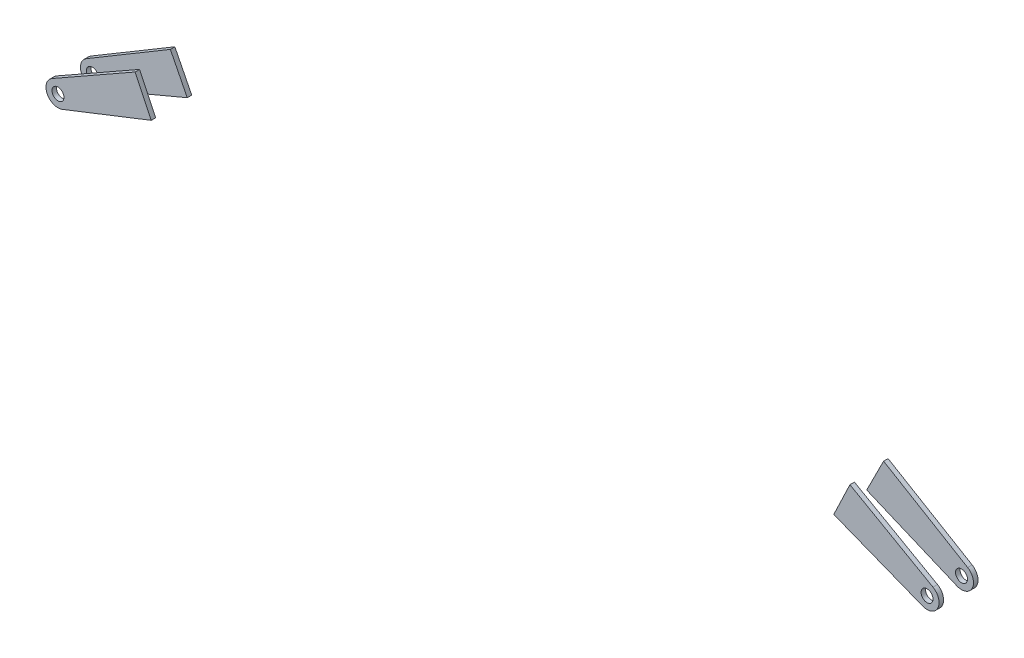
ISO-10303-21;
HEADER;
FILE_DESCRIPTION(('STEP AP214'),'2;1');
FILE_NAME('part.step','',(''),(''),'','','');
FILE_SCHEMA(('AUTOMOTIVE_DESIGN { 1 0 10303 214 1 1 1 1 }'));
ENDSEC;
DATA;
#1=APPLICATION_CONTEXT('core data for automotive mechanical design processes');
#2=APPLICATION_PROTOCOL_DEFINITION('international standard','automotive_design',2000,#1);
#3=PRODUCT_CONTEXT('',#1,'mechanical');
#4=PRODUCT('Part','Part','',(#3));
#5=PRODUCT_RELATED_PRODUCT_CATEGORY('part','',(#4));
#6=PRODUCT_DEFINITION_FORMATION('','',#4);
#7=PRODUCT_DEFINITION_CONTEXT('part definition',#1,'design');
#8=PRODUCT_DEFINITION('design','',#6,#7);
#9=PRODUCT_DEFINITION_SHAPE('','',#8);
#10=(LENGTH_UNIT() NAMED_UNIT(*) SI_UNIT(.MILLI.,.METRE.));
#11=(NAMED_UNIT(*) PLANE_ANGLE_UNIT() SI_UNIT($,.RADIAN.));
#12=(NAMED_UNIT(*) SI_UNIT($,.STERADIAN.) SOLID_ANGLE_UNIT());
#13=UNCERTAINTY_MEASURE_WITH_UNIT(LENGTH_MEASURE(1.E-05),#10,'distance_accuracy_value','');
#14=(GEOMETRIC_REPRESENTATION_CONTEXT(3) GLOBAL_UNCERTAINTY_ASSIGNED_CONTEXT((#13)) GLOBAL_UNIT_ASSIGNED_CONTEXT((#10,
#11,#12)) REPRESENTATION_CONTEXT('',''));
#15=CARTESIAN_POINT('',(0.,0.,0.));
#16=DIRECTION('',(0.,0.,1.));
#17=DIRECTION('',(1.,0.,0.));
#18=AXIS2_PLACEMENT_3D('',#15,#16,#17);
#19=CARTESIAN_POINT('',(0.,0.,151.999999999998));
#20=DIRECTION('',(0.,0.,-1.));
#21=DIRECTION('',(1.,0.,0.));
#22=AXIS2_PLACEMENT_3D('',#19,#20,#21);
#23=PLANE('',#22);
#24=DIRECTION('',(0.921662565807095,0.387992415892221,0.));
#25=VECTOR('',#24,1.);
#26=CARTESIAN_POINT('',(-286.896060672862,-1977.37330052646,151.999999999998));
#27=LINE('',#26,#25);
#28=CARTESIAN_POINT('',(-286.896060672862,-1977.37330052646,151.999999999998));
#29=VERTEX_POINT('',#28);
#30=CARTESIAN_POINT('',(-226.717276886473,-1952.03982971733,151.999999999998));
#31=VERTEX_POINT('',#30);
#32=EDGE_CURVE('E210',#29,#31,#27,.T.);
#33=ORIENTED_EDGE('',*,*,#32,.F.);
#34=CARTESIAN_POINT('',(-290.,-1970.,151.999999999998));
#35=DIRECTION('',(0.,0.,-1.));
#36=DIRECTION('',(-1.,0.,0.));
#37=AXIS2_PLACEMENT_3D('',#34,#35,#36);
#38=CIRCLE('',#37,8.00000000000014);
#39=CARTESIAN_POINT('',(-294.092411866866,-1963.12597897065,151.999999999998));
#40=VERTEX_POINT('',#39);
#41=EDGE_CURVE('E198',#29,#40,#38,.T.);
#42=ORIENTED_EDGE('',*,*,#41,.T.);
#43=DIRECTION('',(-0.859252628668639,-0.511551483358258,0.));
#44=VECTOR('',#43,1.);
#45=CARTESIAN_POINT('',(-237.988605466467,-1929.72487616502,151.999999999998));
#46=LINE('',#45,#44);
#47=CARTESIAN_POINT('',(-237.988605466467,-1929.72487616502,151.999999999998));
#48=VERTEX_POINT('',#47);
#49=EDGE_CURVE('E190',#48,#40,#46,.T.);
#50=ORIENTED_EDGE('',*,*,#49,.F.);
#51=DIRECTION('',(-0.450853143199749,0.892598142092457,0.));
#52=VECTOR('',#51,1.);
#53=CARTESIAN_POINT('',(-226.717276886473,-1952.03982971733,151.999999999998));
#54=LINE('',#53,#52);
#55=EDGE_CURVE('E147',#31,#48,#54,.T.);
#56=ORIENTED_EDGE('',*,*,#55,.F.);
#57=EDGE_LOOP('',(#33,#42,#50,#56));
#58=FACE_BOUND('',#57,.T.);
#59=CARTESIAN_POINT('',(-290.,-1970.,151.999999999998));
#60=DIRECTION('',(0.,0.,-1.));
#61=DIRECTION('',(-1.,0.,0.));
#62=AXIS2_PLACEMENT_3D('',#59,#60,#61);
#63=CIRCLE('',#62,3.99999999999999);
#64=CARTESIAN_POINT('',(-294.,-1970.,151.999999999998));
#65=VERTEX_POINT('',#64);
#66=EDGE_CURVE('E212',#65,#65,#63,.T.);
#67=ORIENTED_EDGE('',*,*,#66,.F.);
#68=EDGE_LOOP('',(#67));
#69=FACE_BOUND('',#68,.T.);
#70=ADVANCED_FACE('F138',(#58,#69),#23,.T.);
#71=CARTESIAN_POINT('',(0.,0.,154.999999999998));
#72=DIRECTION('',(0.,0.,-1.));
#73=DIRECTION('',(1.,0.,0.));
#74=AXIS2_PLACEMENT_3D('',#71,#72,#73);
#75=PLANE('',#74);
#76=DIRECTION('',(0.921662565807095,0.387992415892221,0.));
#77=VECTOR('',#76,1.);
#78=CARTESIAN_POINT('',(-286.896060672862,-1977.37330052646,154.999999999998));
#79=LINE('',#78,#77);
#80=CARTESIAN_POINT('',(-286.896060672862,-1977.37330052646,154.999999999998));
#81=VERTEX_POINT('',#80);
#82=CARTESIAN_POINT('',(-226.717276886473,-1952.03982971733,154.999999999998));
#83=VERTEX_POINT('',#82);
#84=EDGE_CURVE('E226',#81,#83,#79,.T.);
#85=ORIENTED_EDGE('',*,*,#84,.T.);
#86=DIRECTION('',(-0.450853143199749,0.892598142092457,0.));
#87=VECTOR('',#86,1.);
#88=CARTESIAN_POINT('',(-226.717276886473,-1952.03982971733,154.999999999998));
#89=LINE('',#88,#87);
#90=CARTESIAN_POINT('',(-237.988605466467,-1929.72487616502,154.999999999998));
#91=VERTEX_POINT('',#90);
#92=EDGE_CURVE('E13',#83,#91,#89,.T.);
#93=ORIENTED_EDGE('',*,*,#92,.T.);
#94=DIRECTION('',(-0.859252628668639,-0.511551483358258,0.));
#95=VECTOR('',#94,1.);
#96=CARTESIAN_POINT('',(-237.988605466467,-1929.72487616502,154.999999999998));
#97=LINE('',#96,#95);
#98=CARTESIAN_POINT('',(-294.092411866866,-1963.12597897065,154.999999999998));
#99=VERTEX_POINT('',#98);
#100=EDGE_CURVE('E188',#91,#99,#97,.T.);
#101=ORIENTED_EDGE('',*,*,#100,.T.);
#102=CARTESIAN_POINT('',(-290.,-1970.,154.999999999998));
#103=DIRECTION('',(0.,0.,-1.));
#104=DIRECTION('',(-1.,0.,0.));
#105=AXIS2_PLACEMENT_3D('',#102,#103,#104);
#106=CIRCLE('',#105,8.00000000000014);
#107=EDGE_CURVE('E192',#81,#99,#106,.T.);
#108=ORIENTED_EDGE('',*,*,#107,.F.);
#109=EDGE_LOOP('',(#85,#93,#101,#108));
#110=FACE_BOUND('',#109,.T.);
#111=CARTESIAN_POINT('',(-290.,-1970.,154.999999999998));
#112=DIRECTION('',(0.,0.,-1.));
#113=DIRECTION('',(-1.,0.,0.));
#114=AXIS2_PLACEMENT_3D('',#111,#112,#113);
#115=CIRCLE('',#114,3.99999999999999);
#116=CARTESIAN_POINT('',(-294.,-1970.,154.999999999998));
#117=VERTEX_POINT('',#116);
#118=EDGE_CURVE('E238',#117,#117,#115,.T.);
#119=ORIENTED_EDGE('',*,*,#118,.T.);
#120=EDGE_LOOP('',(#119));
#121=FACE_BOUND('',#120,.T.);
#122=ADVANCED_FACE('F200',(#110,#121),#75,.F.);
#123=CARTESIAN_POINT('',(-286.896060672862,-1977.37330052646,154.999999999998));
#124=DIRECTION('',(0.387992415892221,-0.921662565807095,0.));
#125=DIRECTION('',(-0.921662565807095,-0.387992415892221,0.));
#126=AXIS2_PLACEMENT_3D('',#123,#124,#125);
#127=PLANE('',#126);
#128=ORIENTED_EDGE('',*,*,#32,.T.);
#129=DIRECTION('',(0.,0.,-1.));
#130=VECTOR('',#129,1.);
#131=CARTESIAN_POINT('',(-226.717276886473,-1952.03982971733,154.999999999998));
#132=LINE('',#131,#130);
#133=EDGE_CURVE('E156',#83,#31,#132,.T.);
#134=ORIENTED_EDGE('',*,*,#133,.F.);
#135=ORIENTED_EDGE('',*,*,#84,.F.);
#136=DIRECTION('',(0.,0.,-1.));
#137=VECTOR('',#136,1.);
#138=CARTESIAN_POINT('',(-286.896060672862,-1977.37330052646,154.999999999998));
#139=LINE('',#138,#137);
#140=EDGE_CURVE('E172',#81,#29,#139,.T.);
#141=ORIENTED_EDGE('',*,*,#140,.T.);
#142=EDGE_LOOP('',(#128,#134,#135,#141));
#143=FACE_BOUND('',#142,.T.);
#144=ADVANCED_FACE('F253',(#143),#127,.T.);
#145=CARTESIAN_POINT('',(-237.988605466467,-1929.72487616502,154.999999999998));
#146=DIRECTION('',(-0.511551483358258,0.859252628668639,0.));
#147=DIRECTION('',(0.859252628668639,0.511551483358258,0.));
#148=AXIS2_PLACEMENT_3D('',#145,#146,#147);
#149=PLANE('',#148);
#150=ORIENTED_EDGE('',*,*,#49,.T.);
#151=DIRECTION('',(0.,0.,-1.));
#152=VECTOR('',#151,1.);
#153=CARTESIAN_POINT('',(-294.092411866866,-1963.12597897065,154.999999999998));
#154=LINE('',#153,#152);
#155=EDGE_CURVE('E179',#99,#40,#154,.T.);
#156=ORIENTED_EDGE('',*,*,#155,.F.);
#157=ORIENTED_EDGE('',*,*,#100,.F.);
#158=DIRECTION('',(0.,0.,-1.));
#159=VECTOR('',#158,1.);
#160=CARTESIAN_POINT('',(-237.988605466467,-1929.72487616502,154.999999999998));
#161=LINE('',#160,#159);
#162=EDGE_CURVE('E185',#91,#48,#161,.T.);
#163=ORIENTED_EDGE('',*,*,#162,.T.);
#164=EDGE_LOOP('',(#150,#156,#157,#163));
#165=FACE_BOUND('',#164,.T.);
#166=ADVANCED_FACE('F186',(#165),#149,.T.);
#167=CARTESIAN_POINT('',(-226.717276886473,-1952.03982971733,154.999999999998));
#168=DIRECTION('',(0.892598142092457,0.450853143199749,0.));
#169=DIRECTION('',(0.450853143199749,-0.892598142092457,0.));
#170=AXIS2_PLACEMENT_3D('',#167,#168,#169);
#171=PLANE('',#170);
#172=ORIENTED_EDGE('',*,*,#55,.T.);
#173=ORIENTED_EDGE('',*,*,#162,.F.);
#174=ORIENTED_EDGE('',*,*,#92,.F.);
#175=ORIENTED_EDGE('',*,*,#133,.T.);
#176=EDGE_LOOP('',(#172,#173,#174,#175));
#177=FACE_BOUND('',#176,.T.);
#178=ADVANCED_FACE('F260',(#177),#171,.T.);
#179=CARTESIAN_POINT('',(-290.,-1970.,154.999999999998));
#180=DIRECTION('',(0.,0.,-1.));
#181=DIRECTION('',(1.,0.,0.));
#182=AXIS2_PLACEMENT_3D('',#179,#180,#181);
#183=CYLINDRICAL_SURFACE('',#182,8.00000000000014);
#184=ORIENTED_EDGE('',*,*,#41,.F.);
#185=ORIENTED_EDGE('',*,*,#140,.F.);
#186=ORIENTED_EDGE('',*,*,#107,.T.);
#187=ORIENTED_EDGE('',*,*,#155,.T.);
#188=EDGE_LOOP('',(#184,#185,#186,#187));
#189=FACE_BOUND('',#188,.T.);
#190=ADVANCED_FACE('F195',(#189),#183,.T.);
#191=CARTESIAN_POINT('',(-290.,-1970.,154.999999999998));
#192=DIRECTION('',(0.,0.,-1.));
#193=DIRECTION('',(1.,0.,0.));
#194=AXIS2_PLACEMENT_3D('',#191,#192,#193);
#195=CYLINDRICAL_SURFACE('',#194,3.99999999999999);
#196=ORIENTED_EDGE('',*,*,#118,.F.);
#197=EDGE_LOOP('',(#196));
#198=FACE_BOUND('',#197,.T.);
#199=ORIENTED_EDGE('',*,*,#66,.T.);
#200=EDGE_LOOP('',(#199));
#201=FACE_BOUND('',#200,.T.);
#202=ADVANCED_FACE('F242',(#198,#201),#195,.F.);
#203=CLOSED_SHELL('',(#70,#122,#144,#166,#178,#190,#202));
#204=MANIFOLD_SOLID_BREP('B2',#203);
#205=CARTESIAN_POINT('',(2.63160024179318E-11,8.0263807374692E-12,177.999999999859));
#206=DIRECTION('',(1.50377156674017E-13,0.,1.));
#207=DIRECTION('',(-1.,0.,1.50377156674017E-13));
#208=AXIS2_PLACEMENT_3D('',#205,#206,#207);
#209=PLANE('',#208);
#210=CARTESIAN_POINT('',(-290.,-1970.,177.999999999998));
#211=DIRECTION('',(0.,0.,-1.));
#212=DIRECTION('',(-1.,0.,0.));
#213=AXIS2_PLACEMENT_3D('',#210,#211,#212);
#214=CIRCLE('',#213,3.99999999999999);
#215=CARTESIAN_POINT('',(-294.,-1970.,177.999999999998));
#216=VERTEX_POINT('',#215);
#217=EDGE_CURVE('E397',#216,#216,#214,.T.);
#218=ORIENTED_EDGE('',*,*,#217,.T.);
#219=EDGE_LOOP('',(#218));
#220=FACE_BOUND('',#219,.T.);
#221=DIRECTION('',(0.930659776692997,0.365885747256901,-2.04653150000507E-13));
#222=VECTOR('',#221,1.);
#223=CARTESIAN_POINT('',(-287.072914021945,-1977.44527821354,177.999999999998));
#224=LINE('',#223,#222);
#225=CARTESIAN_POINT('',(-287.072914021945,-1977.44527821354,177.999999999998));
#226=VERTEX_POINT('',#225);
#227=CARTESIAN_POINT('',(-227.750255328197,-1954.12277535159,177.999999999985));
#228=VERTEX_POINT('',#227);
#229=EDGE_CURVE('E381',#226,#228,#224,.T.);
#230=ORIENTED_EDGE('',*,*,#229,.T.);
#231=DIRECTION('',(-0.430959965901078,0.9023710477351,0.));
#232=VECTOR('',#231,1.);
#233=CARTESIAN_POINT('',(-227.750255328197,-1954.12277535159,177.999999999985));
#234=LINE('',#233,#232);
#235=CARTESIAN_POINT('',(-238.524254475723,-1931.56349915821,177.999999999986));
#236=VERTEX_POINT('',#235);
#237=EDGE_CURVE('E380',#228,#236,#234,.T.);
#238=ORIENTED_EDGE('',*,*,#237,.T.);
#239=DIRECTION('',(0.869538965268074,0.493864341576234,-1.99427963191984E-13));
#240=VECTOR('',#239,1.);
#241=CARTESIAN_POINT('',(-293.95091473261,-1963.04368827786,177.999999999999));
#242=LINE('',#241,#240);
#243=CARTESIAN_POINT('',(-293.95091473261,-1963.04368827786,177.999999999999));
#244=VERTEX_POINT('',#243);
#245=EDGE_CURVE('E369',#244,#236,#242,.T.);
#246=ORIENTED_EDGE('',*,*,#245,.F.);
#247=CARTESIAN_POINT('',(-290.,-1970.,177.999999999998));
#248=DIRECTION('',(-1.38777878078146E-13,0.,-1.));
#249=DIRECTION('',(-1.,0.,1.38777878078146E-13));
#250=AXIS2_PLACEMENT_3D('',#247,#248,#249);
#251=CIRCLE('',#250,7.9999999999999);
#252=EDGE_CURVE('E326',#226,#244,#251,.T.);
#253=ORIENTED_EDGE('',*,*,#252,.F.);
#254=EDGE_LOOP('',(#230,#238,#246,#253));
#255=FACE_BOUND('',#254,.T.);
#256=ADVANCED_FACE('F317',(#220,#255),#209,.T.);
#257=CARTESIAN_POINT('',(2.63160024179318E-11,8.0263807374692E-12,174.999999999859));
#258=DIRECTION('',(1.50377156674017E-13,0.,1.));
#259=DIRECTION('',(-1.,0.,1.50377156674017E-13));
#260=AXIS2_PLACEMENT_3D('',#257,#258,#259);
#261=PLANE('',#260);
#262=CARTESIAN_POINT('',(-290.,-1970.,174.999999999998));
#263=DIRECTION('',(0.,0.,-1.));
#264=DIRECTION('',(-1.,0.,0.));
#265=AXIS2_PLACEMENT_3D('',#262,#263,#264);
#266=CIRCLE('',#265,3.99999999999999);
#267=CARTESIAN_POINT('',(-294.,-1970.,174.999999999998));
#268=VERTEX_POINT('',#267);
#269=EDGE_CURVE('E433',#268,#268,#266,.T.);
#270=ORIENTED_EDGE('',*,*,#269,.F.);
#271=EDGE_LOOP('',(#270));
#272=FACE_BOUND('',#271,.T.);
#273=DIRECTION('',(0.930659776692997,0.365885747256901,-2.04653150000507E-13));
#274=VECTOR('',#273,1.);
#275=CARTESIAN_POINT('',(-287.072914021945,-1977.44527821354,174.999999999998));
#276=LINE('',#275,#274);
#277=CARTESIAN_POINT('',(-287.072914021945,-1977.44527821354,174.999999999998));
#278=VERTEX_POINT('',#277);
#279=CARTESIAN_POINT('',(-227.750255328197,-1954.12277535159,174.999999999985));
#280=VERTEX_POINT('',#279);
#281=EDGE_CURVE('E377',#278,#280,#276,.T.);
#282=ORIENTED_EDGE('',*,*,#281,.F.);
#283=CARTESIAN_POINT('',(-290.,-1970.,174.999999999998));
#284=DIRECTION('',(-1.38777878078146E-13,0.,-1.));
#285=DIRECTION('',(-1.,0.,1.38777878078146E-13));
#286=AXIS2_PLACEMENT_3D('',#283,#284,#285);
#287=CIRCLE('',#286,7.9999999999999);
#288=CARTESIAN_POINT('',(-293.95091473261,-1963.04368827786,174.999999999999));
#289=VERTEX_POINT('',#288);
#290=EDGE_CURVE('E136',#278,#289,#287,.T.);
#291=ORIENTED_EDGE('',*,*,#290,.T.);
#292=DIRECTION('',(0.869538965268074,0.493864341576234,-1.99427963191984E-13));
#293=VECTOR('',#292,1.);
#294=CARTESIAN_POINT('',(-293.95091473261,-1963.04368827786,174.999999999999));
#295=LINE('',#294,#293);
#296=CARTESIAN_POINT('',(-238.524254475723,-1931.56349915821,174.999999999986));
#297=VERTEX_POINT('',#296);
#298=EDGE_CURVE('E368',#289,#297,#295,.T.);
#299=ORIENTED_EDGE('',*,*,#298,.T.);
#300=DIRECTION('',(-0.430959965901078,0.9023710477351,0.));
#301=VECTOR('',#300,1.);
#302=CARTESIAN_POINT('',(-227.750255328197,-1954.12277535159,174.999999999985));
#303=LINE('',#302,#301);
#304=EDGE_CURVE('E378',#280,#297,#303,.T.);
#305=ORIENTED_EDGE('',*,*,#304,.F.);
#306=EDGE_LOOP('',(#282,#291,#299,#305));
#307=FACE_BOUND('',#306,.T.);
#308=ADVANCED_FACE('F376',(#272,#307),#261,.F.);
#309=CARTESIAN_POINT('',(-287.072914021945,-1977.44527821354,174.999999999998));
#310=DIRECTION('',(-0.365885747256901,0.930659776692997,0.));
#311=DIRECTION('',(0.930659776692997,0.365885747256901,0.));
#312=AXIS2_PLACEMENT_3D('',#309,#310,#311);
#313=PLANE('',#312);
#314=ORIENTED_EDGE('',*,*,#229,.F.);
#315=DIRECTION('',(0.,0.,1.));
#316=VECTOR('',#315,1.);
#317=CARTESIAN_POINT('',(-287.072914021945,-1977.44527821354,174.999999999998));
#318=LINE('',#317,#316);
#319=EDGE_CURVE('E335',#278,#226,#318,.T.);
#320=ORIENTED_EDGE('',*,*,#319,.F.);
#321=ORIENTED_EDGE('',*,*,#281,.T.);
#322=DIRECTION('',(0.,0.,1.));
#323=VECTOR('',#322,1.);
#324=CARTESIAN_POINT('',(-227.750255328197,-1954.12277535159,174.999999999985));
#325=LINE('',#324,#323);
#326=EDGE_CURVE('E344',#280,#228,#325,.T.);
#327=ORIENTED_EDGE('',*,*,#326,.T.);
#328=EDGE_LOOP('',(#314,#320,#321,#327));
#329=FACE_BOUND('',#328,.T.);
#330=ADVANCED_FACE('F415',(#329),#313,.F.);
#331=CARTESIAN_POINT('',(-227.750255328197,-1954.12277535159,174.999999999985));
#332=DIRECTION('',(-0.9023710477351,-0.430959965901078,0.));
#333=DIRECTION('',(-0.430959965901078,0.9023710477351,0.));
#334=AXIS2_PLACEMENT_3D('',#331,#332,#333);
#335=PLANE('',#334);
#336=ORIENTED_EDGE('',*,*,#237,.F.);
#337=ORIENTED_EDGE('',*,*,#326,.F.);
#338=ORIENTED_EDGE('',*,*,#304,.T.);
#339=DIRECTION('',(0.,0.,1.));
#340=VECTOR('',#339,1.);
#341=CARTESIAN_POINT('',(-238.524254475723,-1931.56349915821,174.999999999986));
#342=LINE('',#341,#340);
#343=EDGE_CURVE('E352',#297,#236,#342,.T.);
#344=ORIENTED_EDGE('',*,*,#343,.T.);
#345=EDGE_LOOP('',(#336,#337,#338,#344));
#346=FACE_BOUND('',#345,.T.);
#347=ADVANCED_FACE('F413',(#346),#335,.F.);
#348=CARTESIAN_POINT('',(-290.,-1970.,174.999999999998));
#349=DIRECTION('',(0.,0.,1.));
#350=DIRECTION('',(-1.,0.,0.));
#351=AXIS2_PLACEMENT_3D('',#348,#349,#350);
#352=CYLINDRICAL_SURFACE('',#351,7.9999999999999);
#353=ORIENTED_EDGE('',*,*,#252,.T.);
#354=DIRECTION('',(0.,0.,1.));
#355=VECTOR('',#354,1.);
#356=CARTESIAN_POINT('',(-293.95091473261,-1963.04368827786,174.999999999999));
#357=LINE('',#356,#355);
#358=EDGE_CURVE('E361',#289,#244,#357,.T.);
#359=ORIENTED_EDGE('',*,*,#358,.F.);
#360=ORIENTED_EDGE('',*,*,#290,.F.);
#361=ORIENTED_EDGE('',*,*,#319,.T.);
#362=EDGE_LOOP('',(#353,#359,#360,#361));
#363=FACE_BOUND('',#362,.T.);
#364=ADVANCED_FACE('F363',(#363),#352,.T.);
#365=CARTESIAN_POINT('',(-293.95091473261,-1963.04368827786,174.999999999999));
#366=DIRECTION('',(-0.493864341576234,0.869538965268074,0.));
#367=DIRECTION('',(0.869538965268074,0.493864341576234,0.));
#368=AXIS2_PLACEMENT_3D('',#365,#366,#367);
#369=PLANE('',#368);
#370=ORIENTED_EDGE('',*,*,#245,.T.);
#371=ORIENTED_EDGE('',*,*,#343,.F.);
#372=ORIENTED_EDGE('',*,*,#298,.F.);
#373=ORIENTED_EDGE('',*,*,#358,.T.);
#374=EDGE_LOOP('',(#370,#371,#372,#373));
#375=FACE_BOUND('',#374,.T.);
#376=ADVANCED_FACE('F372',(#375),#369,.T.);
#377=CARTESIAN_POINT('',(-290.,-1970.,174.999999999998));
#378=DIRECTION('',(0.,0.,1.));
#379=DIRECTION('',(-1.,0.,0.));
#380=AXIS2_PLACEMENT_3D('',#377,#378,#379);
#381=CYLINDRICAL_SURFACE('',#380,3.99999999999999);
#382=ORIENTED_EDGE('',*,*,#269,.T.);
#383=EDGE_LOOP('',(#382));
#384=FACE_BOUND('',#383,.T.);
#385=ORIENTED_EDGE('',*,*,#217,.F.);
#386=EDGE_LOOP('',(#385));
#387=FACE_BOUND('',#386,.T.);
#388=ADVANCED_FACE('F441',(#384,#387),#381,.F.);
#389=CLOSED_SHELL('',(#256,#308,#330,#347,#364,#376,#388));
#390=MANIFOLD_SOLID_BREP('B7',#389);
#391=CARTESIAN_POINT('',(0.,0.,151.999999999998));
#392=DIRECTION('',(0.,0.,-1.));
#393=DIRECTION('',(-1.,0.,0.));
#394=AXIS2_PLACEMENT_3D('',#391,#392,#393);
#395=PLANE('',#394);
#396=DIRECTION('',(-0.921662565807095,0.387992415892221,0.));
#397=VECTOR('',#396,1.);
#398=CARTESIAN_POINT('',(286.896060672862,-1977.37330052646,151.999999999998));
#399=LINE('',#398,#397);
#400=CARTESIAN_POINT('',(286.896060672862,-1977.37330052646,151.999999999998));
#401=VERTEX_POINT('',#400);
#402=CARTESIAN_POINT('',(226.717276886473,-1952.03982971733,151.999999999998));
#403=VERTEX_POINT('',#402);
#404=EDGE_CURVE('E525',#401,#403,#399,.T.);
#405=ORIENTED_EDGE('',*,*,#404,.T.);
#406=DIRECTION('',(0.450853143199749,0.892598142092457,0.));
#407=VECTOR('',#406,1.);
#408=CARTESIAN_POINT('',(226.717276886473,-1952.03982971733,151.999999999998));
#409=LINE('',#408,#407);
#410=CARTESIAN_POINT('',(237.988605466467,-1929.72487616502,151.999999999998));
#411=VERTEX_POINT('',#410);
#412=EDGE_CURVE('E504',#403,#411,#409,.T.);
#413=ORIENTED_EDGE('',*,*,#412,.T.);
#414=DIRECTION('',(0.859252628668639,-0.511551483358258,0.));
#415=VECTOR('',#414,1.);
#416=CARTESIAN_POINT('',(237.988605466467,-1929.72487616502,151.999999999998));
#417=LINE('',#416,#415);
#418=CARTESIAN_POINT('',(294.092411866866,-1963.12597897065,151.999999999998));
#419=VERTEX_POINT('',#418);
#420=EDGE_CURVE('E534',#411,#419,#417,.T.);
#421=ORIENTED_EDGE('',*,*,#420,.T.);
#422=CARTESIAN_POINT('',(290.,-1970.,151.999999999998));
#423=DIRECTION('',(0.,0.,1.));
#424=DIRECTION('',(1.,0.,0.));
#425=AXIS2_PLACEMENT_3D('',#422,#423,#424);
#426=CIRCLE('',#425,8.00000000000014);
#427=EDGE_CURVE('E530',#401,#419,#426,.T.);
#428=ORIENTED_EDGE('',*,*,#427,.F.);
#429=EDGE_LOOP('',(#405,#413,#421,#428));
#430=FACE_BOUND('',#429,.T.);
#431=CARTESIAN_POINT('',(290.,-1970.,151.999999999998));
#432=DIRECTION('',(0.,0.,1.));
#433=DIRECTION('',(1.,0.,0.));
#434=AXIS2_PLACEMENT_3D('',#431,#432,#433);
#435=CIRCLE('',#434,3.99999999999999);
#436=CARTESIAN_POINT('',(294.,-1970.,151.999999999998));
#437=VERTEX_POINT('',#436);
#438=EDGE_CURVE('E569',#437,#437,#435,.T.);
#439=ORIENTED_EDGE('',*,*,#438,.T.);
#440=EDGE_LOOP('',(#439));
#441=FACE_BOUND('',#440,.T.);
#442=ADVANCED_FACE('F495',(#430,#441),#395,.T.);
#443=CARTESIAN_POINT('',(0.,0.,154.999999999998));
#444=DIRECTION('',(0.,0.,-1.));
#445=DIRECTION('',(-1.,0.,0.));
#446=AXIS2_PLACEMENT_3D('',#443,#444,#445);
#447=PLANE('',#446);
#448=DIRECTION('',(-0.921662565807095,0.387992415892221,0.));
#449=VECTOR('',#448,1.);
#450=CARTESIAN_POINT('',(286.896060672862,-1977.37330052646,154.999999999998));
#451=LINE('',#450,#449);
#452=CARTESIAN_POINT('',(286.896060672862,-1977.37330052646,154.999999999998));
#453=VERTEX_POINT('',#452);
#454=CARTESIAN_POINT('',(226.717276886473,-1952.03982971733,154.999999999998));
#455=VERTEX_POINT('',#454);
#456=EDGE_CURVE('E549',#453,#455,#451,.T.);
#457=ORIENTED_EDGE('',*,*,#456,.F.);
#458=CARTESIAN_POINT('',(290.,-1970.,154.999999999998));
#459=DIRECTION('',(0.,0.,1.));
#460=DIRECTION('',(1.,0.,0.));
#461=AXIS2_PLACEMENT_3D('',#458,#459,#460);
#462=CIRCLE('',#461,8.00000000000014);
#463=CARTESIAN_POINT('',(294.092411866866,-1963.12597897065,154.999999999998));
#464=VERTEX_POINT('',#463);
#465=EDGE_CURVE('E541',#453,#464,#462,.T.);
#466=ORIENTED_EDGE('',*,*,#465,.T.);
#467=DIRECTION('',(0.859252628668639,-0.511551483358258,0.));
#468=VECTOR('',#467,1.);
#469=CARTESIAN_POINT('',(237.988605466467,-1929.72487616502,154.999999999998));
#470=LINE('',#469,#468);
#471=CARTESIAN_POINT('',(237.988605466467,-1929.72487616502,154.999999999998));
#472=VERTEX_POINT('',#471);
#473=EDGE_CURVE('E546',#472,#464,#470,.T.);
#474=ORIENTED_EDGE('',*,*,#473,.F.);
#475=DIRECTION('',(0.450853143199749,0.892598142092457,0.));
#476=VECTOR('',#475,1.);
#477=CARTESIAN_POINT('',(226.717276886473,-1952.03982971733,154.999999999998));
#478=LINE('',#477,#476);
#479=EDGE_CURVE('E315',#455,#472,#478,.T.);
#480=ORIENTED_EDGE('',*,*,#479,.F.);
#481=EDGE_LOOP('',(#457,#466,#474,#480));
#482=FACE_BOUND('',#481,.T.);
#483=CARTESIAN_POINT('',(290.,-1970.,154.999999999998));
#484=DIRECTION('',(0.,0.,1.));
#485=DIRECTION('',(1.,0.,0.));
#486=AXIS2_PLACEMENT_3D('',#483,#484,#485);
#487=CIRCLE('',#486,3.99999999999999);
#488=CARTESIAN_POINT('',(294.,-1970.,154.999999999998));
#489=VERTEX_POINT('',#488);
#490=EDGE_CURVE('E596',#489,#489,#487,.T.);
#491=ORIENTED_EDGE('',*,*,#490,.F.);
#492=EDGE_LOOP('',(#491));
#493=FACE_BOUND('',#492,.T.);
#494=ADVANCED_FACE('F543',(#482,#493),#447,.F.);
#495=CARTESIAN_POINT('',(286.896060672862,-1977.37330052646,154.999999999998));
#496=DIRECTION('',(-0.387992415892221,-0.921662565807095,0.));
#497=DIRECTION('',(0.921662565807095,-0.387992415892221,0.));
#498=AXIS2_PLACEMENT_3D('',#495,#496,#497);
#499=PLANE('',#498);
#500=ORIENTED_EDGE('',*,*,#404,.F.);
#501=DIRECTION('',(0.,0.,-1.));
#502=VECTOR('',#501,1.);
#503=CARTESIAN_POINT('',(286.896060672862,-1977.37330052646,154.999999999998));
#504=LINE('',#503,#502);
#505=EDGE_CURVE('E568',#453,#401,#504,.T.);
#506=ORIENTED_EDGE('',*,*,#505,.F.);
#507=ORIENTED_EDGE('',*,*,#456,.T.);
#508=DIRECTION('',(0.,0.,-1.));
#509=VECTOR('',#508,1.);
#510=CARTESIAN_POINT('',(226.717276886473,-1952.03982971733,154.999999999998));
#511=LINE('',#510,#509);
#512=EDGE_CURVE('E582',#455,#403,#511,.T.);
#513=ORIENTED_EDGE('',*,*,#512,.T.);
#514=EDGE_LOOP('',(#500,#506,#507,#513));
#515=FACE_BOUND('',#514,.T.);
#516=ADVANCED_FACE('F603',(#515),#499,.T.);
#517=CARTESIAN_POINT('',(237.988605466467,-1929.72487616502,154.999999999998));
#518=DIRECTION('',(0.511551483358258,0.859252628668639,0.));
#519=DIRECTION('',(-0.859252628668639,0.511551483358258,0.));
#520=AXIS2_PLACEMENT_3D('',#517,#518,#519);
#521=PLANE('',#520);
#522=ORIENTED_EDGE('',*,*,#420,.F.);
#523=DIRECTION('',(0.,0.,-1.));
#524=VECTOR('',#523,1.);
#525=CARTESIAN_POINT('',(237.988605466467,-1929.72487616502,154.999999999998));
#526=LINE('',#525,#524);
#527=EDGE_CURVE('E558',#472,#411,#526,.T.);
#528=ORIENTED_EDGE('',*,*,#527,.F.);
#529=ORIENTED_EDGE('',*,*,#473,.T.);
#530=DIRECTION('',(0.,0.,-1.));
#531=VECTOR('',#530,1.);
#532=CARTESIAN_POINT('',(294.092411866866,-1963.12597897065,154.999999999998));
#533=LINE('',#532,#531);
#534=EDGE_CURVE('E552',#464,#419,#533,.T.);
#535=ORIENTED_EDGE('',*,*,#534,.T.);
#536=EDGE_LOOP('',(#522,#528,#529,#535));
#537=FACE_BOUND('',#536,.T.);
#538=ADVANCED_FACE('F557',(#537),#521,.T.);
#539=CARTESIAN_POINT('',(226.717276886473,-1952.03982971733,154.999999999998));
#540=DIRECTION('',(-0.892598142092457,0.450853143199749,0.));
#541=DIRECTION('',(-0.450853143199749,-0.892598142092457,0.));
#542=AXIS2_PLACEMENT_3D('',#539,#540,#541);
#543=PLANE('',#542);
#544=ORIENTED_EDGE('',*,*,#412,.F.);
#545=ORIENTED_EDGE('',*,*,#512,.F.);
#546=ORIENTED_EDGE('',*,*,#479,.T.);
#547=ORIENTED_EDGE('',*,*,#527,.T.);
#548=EDGE_LOOP('',(#544,#545,#546,#547));
#549=FACE_BOUND('',#548,.T.);
#550=ADVANCED_FACE('F611',(#549),#543,.T.);
#551=CARTESIAN_POINT('',(290.,-1970.,154.999999999998));
#552=DIRECTION('',(0.,0.,-1.));
#553=DIRECTION('',(-1.,0.,0.));
#554=AXIS2_PLACEMENT_3D('',#551,#552,#553);
#555=CYLINDRICAL_SURFACE('',#554,8.00000000000014);
#556=ORIENTED_EDGE('',*,*,#427,.T.);
#557=ORIENTED_EDGE('',*,*,#534,.F.);
#558=ORIENTED_EDGE('',*,*,#465,.F.);
#559=ORIENTED_EDGE('',*,*,#505,.T.);
#560=EDGE_LOOP('',(#556,#557,#558,#559));
#561=FACE_BOUND('',#560,.T.);
#562=ADVANCED_FACE('F554',(#561),#555,.T.);
#563=CARTESIAN_POINT('',(290.,-1970.,154.999999999998));
#564=DIRECTION('',(0.,0.,-1.));
#565=DIRECTION('',(-1.,0.,0.));
#566=AXIS2_PLACEMENT_3D('',#563,#564,#565);
#567=CYLINDRICAL_SURFACE('',#566,3.99999999999999);
#568=ORIENTED_EDGE('',*,*,#490,.T.);
#569=EDGE_LOOP('',(#568));
#570=FACE_BOUND('',#569,.T.);
#571=ORIENTED_EDGE('',*,*,#438,.F.);
#572=EDGE_LOOP('',(#571));
#573=FACE_BOUND('',#572,.T.);
#574=ADVANCED_FACE('F600',(#570,#573),#567,.F.);
#575=CLOSED_SHELL('',(#442,#494,#516,#538,#550,#562,#574));
#576=MANIFOLD_SOLID_BREP('B130',#575);
#577=CARTESIAN_POINT('',(-2.63160024179318E-11,8.0263807374692E-12,177.999999999859));
#578=DIRECTION('',(-1.50377156674017E-13,0.,1.));
#579=DIRECTION('',(1.,0.,1.50377156674017E-13));
#580=AXIS2_PLACEMENT_3D('',#577,#578,#579);
#581=PLANE('',#580);
#582=CARTESIAN_POINT('',(290.,-1970.,177.999999999998));
#583=DIRECTION('',(0.,0.,1.));
#584=DIRECTION('',(1.,0.,0.));
#585=AXIS2_PLACEMENT_3D('',#582,#583,#584);
#586=CIRCLE('',#585,3.99999999999999);
#587=CARTESIAN_POINT('',(294.,-1970.,177.999999999998));
#588=VERTEX_POINT('',#587);
#589=EDGE_CURVE('E739',#588,#588,#586,.T.);
#590=ORIENTED_EDGE('',*,*,#589,.F.);
#591=EDGE_LOOP('',(#590));
#592=FACE_BOUND('',#591,.T.);
#593=DIRECTION('',(-0.930659776692997,0.365885747256901,-2.04653150000507E-13));
#594=VECTOR('',#593,1.);
#595=CARTESIAN_POINT('',(287.072914021945,-1977.44527821354,177.999999999998));
#596=LINE('',#595,#594);
#597=CARTESIAN_POINT('',(287.072914021945,-1977.44527821354,177.999999999998));
#598=VERTEX_POINT('',#597);
#599=CARTESIAN_POINT('',(227.750255328197,-1954.12277535159,177.999999999985));
#600=VERTEX_POINT('',#599);
#601=EDGE_CURVE('E692',#598,#600,#596,.T.);
#602=ORIENTED_EDGE('',*,*,#601,.F.);
#603=CARTESIAN_POINT('',(290.,-1970.,177.999999999998));
#604=DIRECTION('',(-1.38777878078146E-13,0.,1.));
#605=DIRECTION('',(1.,0.,1.38777878078146E-13));
#606=AXIS2_PLACEMENT_3D('',#603,#604,#605);
#607=CIRCLE('',#606,7.9999999999999);
#608=CARTESIAN_POINT('',(293.95091473261,-1963.04368827786,177.999999999999));
#609=VERTEX_POINT('',#608);
#610=EDGE_CURVE('E673',#598,#609,#607,.T.);
#611=ORIENTED_EDGE('',*,*,#610,.T.);
#612=DIRECTION('',(-0.869538965268074,0.493864341576234,-1.99427963191984E-13));
#613=VECTOR('',#612,1.);
#614=CARTESIAN_POINT('',(293.95091473261,-1963.04368827786,177.999999999999));
#615=LINE('',#614,#613);
#616=CARTESIAN_POINT('',(238.524254475723,-1931.56349915821,177.999999999986));
#617=VERTEX_POINT('',#616);
#618=EDGE_CURVE('E726',#609,#617,#615,.T.);
#619=ORIENTED_EDGE('',*,*,#618,.T.);
#620=DIRECTION('',(0.430959965901078,0.9023710477351,0.));
#621=VECTOR('',#620,1.);
#622=CARTESIAN_POINT('',(227.750255328197,-1954.12277535159,177.999999999985));
#623=LINE('',#622,#621);
#624=EDGE_CURVE('E701',#600,#617,#623,.T.);
#625=ORIENTED_EDGE('',*,*,#624,.F.);
#626=EDGE_LOOP('',(#602,#611,#619,#625));
#627=FACE_BOUND('',#626,.T.);
#628=ADVANCED_FACE('F664',(#592,#627),#581,.T.);
#629=CARTESIAN_POINT('',(-2.63160024179318E-11,8.0263807374692E-12,174.999999999859));
#630=DIRECTION('',(-1.50377156674017E-13,0.,1.));
#631=DIRECTION('',(1.,0.,1.50377156674017E-13));
#632=AXIS2_PLACEMENT_3D('',#629,#630,#631);
#633=PLANE('',#632);
#634=CARTESIAN_POINT('',(290.,-1970.,174.999999999998));
#635=DIRECTION('',(0.,0.,1.));
#636=DIRECTION('',(1.,0.,0.));
#637=AXIS2_PLACEMENT_3D('',#634,#635,#636);
#638=CIRCLE('',#637,3.99999999999999);
#639=CARTESIAN_POINT('',(294.,-1970.,174.999999999998));
#640=VERTEX_POINT('',#639);
#641=EDGE_CURVE('E764',#640,#640,#638,.T.);
#642=ORIENTED_EDGE('',*,*,#641,.T.);
#643=EDGE_LOOP('',(#642));
#644=FACE_BOUND('',#643,.T.);
#645=DIRECTION('',(-0.930659776692997,0.365885747256901,-2.04653150000507E-13));
#646=VECTOR('',#645,1.);
#647=CARTESIAN_POINT('',(287.072914021945,-1977.44527821354,174.999999999998));
#648=LINE('',#647,#646);
#649=CARTESIAN_POINT('',(287.072914021945,-1977.44527821354,174.999999999998));
#650=VERTEX_POINT('',#649);
#651=CARTESIAN_POINT('',(227.750255328197,-1954.12277535159,174.999999999985));
#652=VERTEX_POINT('',#651);
#653=EDGE_CURVE('E682',#650,#652,#648,.T.);
#654=ORIENTED_EDGE('',*,*,#653,.T.);
#655=DIRECTION('',(0.430959965901078,0.9023710477351,0.));
#656=VECTOR('',#655,1.);
#657=CARTESIAN_POINT('',(227.750255328197,-1954.12277535159,174.999999999985));
#658=LINE('',#657,#656);
#659=CARTESIAN_POINT('',(238.524254475723,-1931.56349915821,174.999999999986));
#660=VERTEX_POINT('',#659);
#661=EDGE_CURVE('E721',#652,#660,#658,.T.);
#662=ORIENTED_EDGE('',*,*,#661,.T.);
#663=DIRECTION('',(-0.869538965268074,0.493864341576234,-1.99427963191984E-13));
#664=VECTOR('',#663,1.);
#665=CARTESIAN_POINT('',(293.95091473261,-1963.04368827786,174.999999999999));
#666=LINE('',#665,#664);
#667=CARTESIAN_POINT('',(293.95091473261,-1963.04368827786,174.999999999999));
#668=VERTEX_POINT('',#667);
#669=EDGE_CURVE('E719',#668,#660,#666,.T.);
#670=ORIENTED_EDGE('',*,*,#669,.F.);
#671=CARTESIAN_POINT('',(290.,-1970.,174.999999999998));
#672=DIRECTION('',(-1.38777878078146E-13,0.,1.));
#673=DIRECTION('',(1.,0.,1.38777878078146E-13));
#674=AXIS2_PLACEMENT_3D('',#671,#672,#673);
#675=CIRCLE('',#674,7.9999999999999);
#676=EDGE_CURVE('E493',#650,#668,#675,.T.);
#677=ORIENTED_EDGE('',*,*,#676,.F.);
#678=EDGE_LOOP('',(#654,#662,#670,#677));
#679=FACE_BOUND('',#678,.T.);
#680=ADVANCED_FACE('F720',(#644,#679),#633,.F.);
#681=CARTESIAN_POINT('',(287.072914021945,-1977.44527821354,174.999999999998));
#682=DIRECTION('',(0.365885747256901,0.930659776692997,0.));
#683=DIRECTION('',(-0.930659776692997,0.365885747256901,0.));
#684=AXIS2_PLACEMENT_3D('',#681,#682,#683);
#685=PLANE('',#684);
#686=ORIENTED_EDGE('',*,*,#601,.T.);
#687=DIRECTION('',(0.,0.,1.));
#688=VECTOR('',#687,1.);
#689=CARTESIAN_POINT('',(227.750255328197,-1954.12277535159,174.999999999985));
#690=LINE('',#689,#688);
#691=EDGE_CURVE('E751',#652,#600,#690,.T.);
#692=ORIENTED_EDGE('',*,*,#691,.F.);
#693=ORIENTED_EDGE('',*,*,#653,.F.);
#694=DIRECTION('',(0.,0.,1.));
#695=VECTOR('',#694,1.);
#696=CARTESIAN_POINT('',(287.072914021945,-1977.44527821354,174.999999999998));
#697=LINE('',#696,#695);
#698=EDGE_CURVE('E716',#650,#598,#697,.T.);
#699=ORIENTED_EDGE('',*,*,#698,.T.);
#700=EDGE_LOOP('',(#686,#692,#693,#699));
#701=FACE_BOUND('',#700,.T.);
#702=ADVANCED_FACE('F777',(#701),#685,.F.);
#703=CARTESIAN_POINT('',(227.750255328197,-1954.12277535159,174.999999999985));
#704=DIRECTION('',(0.9023710477351,-0.430959965901078,0.));
#705=DIRECTION('',(0.430959965901078,0.9023710477351,0.));
#706=AXIS2_PLACEMENT_3D('',#703,#704,#705);
#707=PLANE('',#706);
#708=ORIENTED_EDGE('',*,*,#624,.T.);
#709=DIRECTION('',(0.,0.,1.));
#710=VECTOR('',#709,1.);
#711=CARTESIAN_POINT('',(238.524254475723,-1931.56349915821,174.999999999986));
#712=LINE('',#711,#710);
#713=EDGE_CURVE('E728',#660,#617,#712,.T.);
#714=ORIENTED_EDGE('',*,*,#713,.F.);
#715=ORIENTED_EDGE('',*,*,#661,.F.);
#716=ORIENTED_EDGE('',*,*,#691,.T.);
#717=EDGE_LOOP('',(#708,#714,#715,#716));
#718=FACE_BOUND('',#717,.T.);
#719=ADVANCED_FACE('F779',(#718),#707,.F.);
#720=CARTESIAN_POINT('',(290.,-1970.,174.999999999998));
#721=DIRECTION('',(0.,0.,1.));
#722=DIRECTION('',(1.,0.,0.));
#723=AXIS2_PLACEMENT_3D('',#720,#721,#722);
#724=CYLINDRICAL_SURFACE('',#723,7.9999999999999);
#725=ORIENTED_EDGE('',*,*,#610,.F.);
#726=ORIENTED_EDGE('',*,*,#698,.F.);
#727=ORIENTED_EDGE('',*,*,#676,.T.);
#728=DIRECTION('',(0.,0.,1.));
#729=VECTOR('',#728,1.);
#730=CARTESIAN_POINT('',(293.95091473261,-1963.04368827786,174.999999999999));
#731=LINE('',#730,#729);
#732=EDGE_CURVE('E714',#668,#609,#731,.T.);
#733=ORIENTED_EDGE('',*,*,#732,.T.);
#734=EDGE_LOOP('',(#725,#726,#727,#733));
#735=FACE_BOUND('',#734,.T.);
#736=ADVANCED_FACE('F712',(#735),#724,.T.);
#737=CARTESIAN_POINT('',(293.95091473261,-1963.04368827786,174.999999999999));
#738=DIRECTION('',(0.493864341576234,0.869538965268074,0.));
#739=DIRECTION('',(-0.869538965268074,0.493864341576234,0.));
#740=AXIS2_PLACEMENT_3D('',#737,#738,#739);
#741=PLANE('',#740);
#742=ORIENTED_EDGE('',*,*,#618,.F.);
#743=ORIENTED_EDGE('',*,*,#732,.F.);
#744=ORIENTED_EDGE('',*,*,#669,.T.);
#745=ORIENTED_EDGE('',*,*,#713,.T.);
#746=EDGE_LOOP('',(#742,#743,#744,#745));
#747=FACE_BOUND('',#746,.T.);
#748=ADVANCED_FACE('F724',(#747),#741,.T.);
#749=CARTESIAN_POINT('',(290.,-1970.,174.999999999998));
#750=DIRECTION('',(0.,0.,1.));
#751=DIRECTION('',(1.,0.,0.));
#752=AXIS2_PLACEMENT_3D('',#749,#750,#751);
#753=CYLINDRICAL_SURFACE('',#752,3.99999999999999);
#754=ORIENTED_EDGE('',*,*,#641,.F.);
#755=EDGE_LOOP('',(#754));
#756=FACE_BOUND('',#755,.T.);
#757=ORIENTED_EDGE('',*,*,#589,.T.);
#758=EDGE_LOOP('',(#757));
#759=FACE_BOUND('',#758,.T.);
#760=ADVANCED_FACE('F769',(#756,#759),#753,.F.);
#761=CLOSED_SHELL('',(#628,#680,#702,#719,#736,#748,#760));
#762=MANIFOLD_SOLID_BREP('B309',#761);
#763=ADVANCED_BREP_SHAPE_REPRESENTATION('',(#18,#204,#390,#576,#762),#14);
#764=SHAPE_DEFINITION_REPRESENTATION(#9,#763);
ENDSEC;
END-ISO-10303-21;
